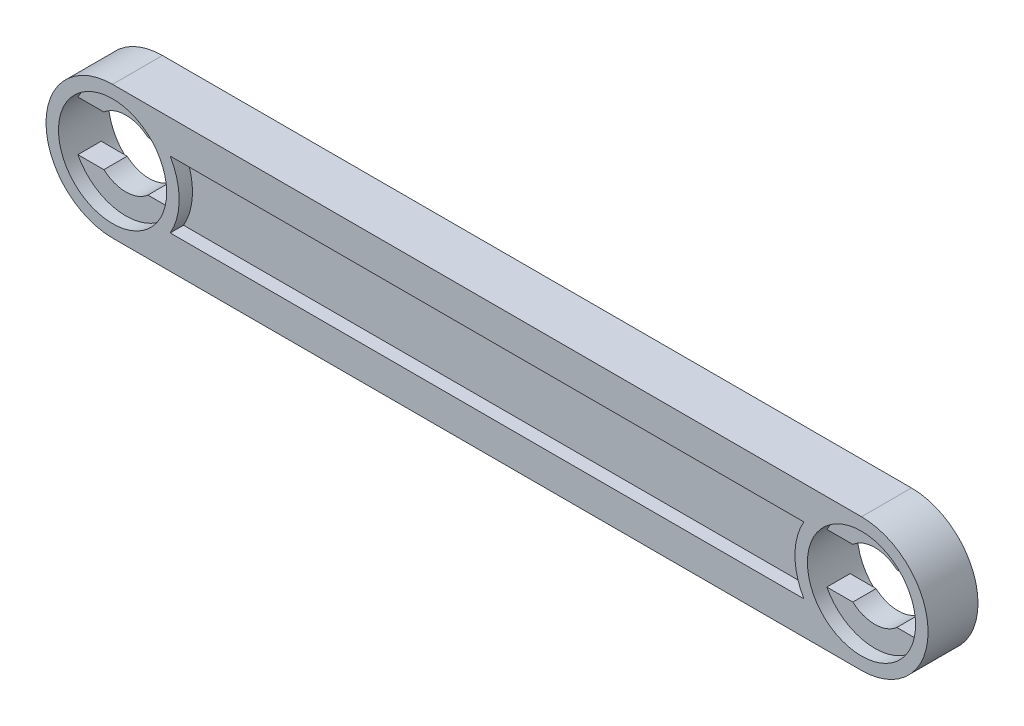
ISO-10303-21;
HEADER;
FILE_DESCRIPTION(('STEP AP214'),'2;1');
FILE_NAME('part.step','',(''),(''),'','','');
FILE_SCHEMA(('AUTOMOTIVE_DESIGN { 1 0 10303 214 1 1 1 1 }'));
ENDSEC;
DATA;
#1=APPLICATION_CONTEXT('core data for automotive mechanical design processes');
#2=APPLICATION_PROTOCOL_DEFINITION('international standard','automotive_design',2000,#1);
#3=PRODUCT_CONTEXT('',#1,'mechanical');
#4=PRODUCT('Part','Part','',(#3));
#5=PRODUCT_RELATED_PRODUCT_CATEGORY('part','',(#4));
#6=PRODUCT_DEFINITION_FORMATION('','',#4);
#7=PRODUCT_DEFINITION_CONTEXT('part definition',#1,'design');
#8=PRODUCT_DEFINITION('design','',#6,#7);
#9=PRODUCT_DEFINITION_SHAPE('','',#8);
#10=(LENGTH_UNIT() NAMED_UNIT(*) SI_UNIT(.MILLI.,.METRE.));
#11=(NAMED_UNIT(*) PLANE_ANGLE_UNIT() SI_UNIT($,.RADIAN.));
#12=(NAMED_UNIT(*) SI_UNIT($,.STERADIAN.) SOLID_ANGLE_UNIT());
#13=UNCERTAINTY_MEASURE_WITH_UNIT(LENGTH_MEASURE(1.E-05),#10,'distance_accuracy_value','');
#14=(GEOMETRIC_REPRESENTATION_CONTEXT(3) GLOBAL_UNCERTAINTY_ASSIGNED_CONTEXT((#13)) GLOBAL_UNIT_ASSIGNED_CONTEXT((#10,
#11,#12)) REPRESENTATION_CONTEXT('',''));
#15=CARTESIAN_POINT('',(0.,0.,0.));
#16=DIRECTION('',(0.,0.,1.));
#17=DIRECTION('',(1.,0.,0.));
#18=AXIS2_PLACEMENT_3D('',#15,#16,#17);
#19=CARTESIAN_POINT('',(0.,0.,0.));
#20=DIRECTION('',(0.,0.,1.));
#21=DIRECTION('',(1.,0.,0.));
#22=AXIS2_PLACEMENT_3D('',#19,#20,#21);
#23=PLANE('',#22);
#24=CARTESIAN_POINT('',(45.,0.,0.));
#25=DIRECTION('',(0.,0.,-1.));
#26=DIRECTION('',(1.,0.,0.));
#27=AXIS2_PLACEMENT_3D('',#24,#25,#26);
#28=CIRCLE('',#27,4.);
#29=CARTESIAN_POINT('',(41.5358983848623,-2.,0.));
#30=VERTEX_POINT('',#29);
#31=CARTESIAN_POINT('',(41.5358983848623,2.,0.));
#32=VERTEX_POINT('',#31);
#33=EDGE_CURVE('E57',#30,#32,#28,.T.);
#34=ORIENTED_EDGE('',*,*,#33,.F.);
#35=DIRECTION('',(1.,0.,0.));
#36=VECTOR('',#35,1.);
#37=CARTESIAN_POINT('',(3.46410161513775,-2.,0.));
#38=LINE('',#37,#36);
#39=CARTESIAN_POINT('',(3.46410161513775,-2.,0.));
#40=VERTEX_POINT('',#39);
#41=EDGE_CURVE('E261',#40,#30,#38,.T.);
#42=ORIENTED_EDGE('',*,*,#41,.F.);
#43=CARTESIAN_POINT('',(0.,0.,0.));
#44=DIRECTION('',(0.,0.,-1.));
#45=DIRECTION('',(1.,0.,0.));
#46=AXIS2_PLACEMENT_3D('',#43,#44,#45);
#47=CIRCLE('',#46,4.);
#48=CARTESIAN_POINT('',(3.46410161513775,2.,0.));
#49=VERTEX_POINT('',#48);
#50=EDGE_CURVE('E275',#49,#40,#47,.T.);
#51=ORIENTED_EDGE('',*,*,#50,.F.);
#52=DIRECTION('',(-1.,0.,0.));
#53=VECTOR('',#52,1.);
#54=CARTESIAN_POINT('',(3.46410161513775,2.,0.));
#55=LINE('',#54,#53);
#56=EDGE_CURVE('E272',#32,#49,#55,.T.);
#57=ORIENTED_EDGE('',*,*,#56,.F.);
#58=EDGE_LOOP('',(#34,#42,#51,#57));
#59=FACE_BOUND('',#58,.T.);
#60=CARTESIAN_POINT('',(0.,0.,0.));
#61=DIRECTION('',(0.,0.,1.));
#62=DIRECTION('',(1.,0.,0.));
#63=AXIS2_PLACEMENT_3D('',#60,#61,#62);
#64=CIRCLE('',#63,4.);
#65=CARTESIAN_POINT('',(0.,4.,0.));
#66=VERTEX_POINT('',#65);
#67=CARTESIAN_POINT('',(0.,-4.,0.));
#68=VERTEX_POINT('',#67);
#69=EDGE_CURVE('E393',#66,#68,#64,.T.);
#70=ORIENTED_EDGE('',*,*,#69,.T.);
#71=DIRECTION('',(1.,0.,0.));
#72=VECTOR('',#71,1.);
#73=CARTESIAN_POINT('',(0.,-4.,0.));
#74=LINE('',#73,#72);
#75=CARTESIAN_POINT('',(45.,-4.,0.));
#76=VERTEX_POINT('',#75);
#77=EDGE_CURVE('E423',#68,#76,#74,.T.);
#78=ORIENTED_EDGE('',*,*,#77,.T.);
#79=CARTESIAN_POINT('',(45.,0.,0.));
#80=DIRECTION('',(0.,0.,1.));
#81=DIRECTION('',(1.,0.,0.));
#82=AXIS2_PLACEMENT_3D('',#79,#80,#81);
#83=CIRCLE('',#82,4.);
#84=CARTESIAN_POINT('',(45.,4.,0.));
#85=VERTEX_POINT('',#84);
#86=EDGE_CURVE('E426',#76,#85,#83,.T.);
#87=ORIENTED_EDGE('',*,*,#86,.T.);
#88=DIRECTION('',(-1.,0.,0.));
#89=VECTOR('',#88,1.);
#90=CARTESIAN_POINT('',(0.,4.,0.));
#91=LINE('',#90,#89);
#92=EDGE_CURVE('E411',#85,#66,#91,.T.);
#93=ORIENTED_EDGE('',*,*,#92,.T.);
#94=EDGE_LOOP('',(#70,#78,#87,#93));
#95=FACE_BOUND('',#94,.T.);
#96=CARTESIAN_POINT('',(0.,0.,0.));
#97=DIRECTION('',(0.,0.,1.));
#98=DIRECTION('',(1.,0.,0.));
#99=AXIS2_PLACEMENT_3D('',#96,#97,#98);
#100=CIRCLE('',#99,3.25);
#101=CARTESIAN_POINT('',(3.25,0.,0.));
#102=VERTEX_POINT('',#101);
#103=EDGE_CURVE('E387',#102,#102,#100,.T.);
#104=ORIENTED_EDGE('',*,*,#103,.F.);
#105=EDGE_LOOP('',(#104));
#106=FACE_BOUND('',#105,.T.);
#107=CARTESIAN_POINT('',(45.,0.,0.));
#108=DIRECTION('',(0.,0.,-1.));
#109=DIRECTION('',(-1.,0.,0.));
#110=AXIS2_PLACEMENT_3D('',#107,#108,#109);
#111=CIRCLE('',#110,3.25);
#112=CARTESIAN_POINT('',(41.75,0.,0.));
#113=VERTEX_POINT('',#112);
#114=EDGE_CURVE('E324',#113,#113,#111,.T.);
#115=ORIENTED_EDGE('',*,*,#114,.T.);
#116=EDGE_LOOP('',(#115));
#117=FACE_BOUND('',#116,.T.);
#118=ADVANCED_FACE('F34',(#59,#95,#106,#117),#23,.T.);
#119=CARTESIAN_POINT('',(47.8831406486677,-1.5,-3.001));
#120=DIRECTION('',(0.,1.,0.));
#121=DIRECTION('',(0.,0.,1.));
#122=AXIS2_PLACEMENT_3D('',#119,#120,#121);
#123=PLANE('',#122);
#124=DIRECTION('',(1.,0.,0.));
#125=VECTOR('',#124,1.);
#126=CARTESIAN_POINT('',(47.8831406486677,-1.5,-2.2));
#127=LINE('',#126,#125);
#128=CARTESIAN_POINT('',(46.3228756555323,-1.5,-2.2));
#129=VERTEX_POINT('',#128);
#130=CARTESIAN_POINT('',(47.8831406486677,-1.5,-2.2));
#131=VERTEX_POINT('',#130);
#132=EDGE_CURVE('E300',#129,#131,#127,.T.);
#133=ORIENTED_EDGE('',*,*,#132,.F.);
#134=DIRECTION('',(0.,0.,1.));
#135=VECTOR('',#134,1.);
#136=CARTESIAN_POINT('',(46.3228756555323,-1.5,-3.001));
#137=LINE('',#136,#135);
#138=CARTESIAN_POINT('',(46.3228756555323,-1.5,-0.8));
#139=VERTEX_POINT('',#138);
#140=EDGE_CURVE('E331',#129,#139,#137,.T.);
#141=ORIENTED_EDGE('',*,*,#140,.T.);
#142=DIRECTION('',(1.,0.,0.));
#143=VECTOR('',#142,1.);
#144=CARTESIAN_POINT('',(47.8831406486677,-1.5,-0.8));
#145=LINE('',#144,#143);
#146=CARTESIAN_POINT('',(47.8831406486677,-1.5,-0.8));
#147=VERTEX_POINT('',#146);
#148=EDGE_CURVE('E318',#139,#147,#145,.T.);
#149=ORIENTED_EDGE('',*,*,#148,.T.);
#150=DIRECTION('',(0.,0.,1.));
#151=VECTOR('',#150,1.);
#152=CARTESIAN_POINT('',(47.8831406486677,-1.5,-3.001));
#153=LINE('',#152,#151);
#154=EDGE_CURVE('E328',#131,#147,#153,.T.);
#155=ORIENTED_EDGE('',*,*,#154,.F.);
#156=EDGE_LOOP('',(#133,#141,#149,#155));
#157=FACE_BOUND('',#156,.T.);
#158=ADVANCED_FACE('F476',(#157),#123,.T.);
#159=CARTESIAN_POINT('',(45.,0.,-3.001));
#160=DIRECTION('',(0.,0.,1.));
#161=DIRECTION('',(1.,0.,0.));
#162=AXIS2_PLACEMENT_3D('',#159,#160,#161);
#163=CYLINDRICAL_SURFACE('',#162,2.);
#164=CARTESIAN_POINT('',(45.,0.,-2.2));
#165=DIRECTION('',(0.,0.,1.));
#166=DIRECTION('',(1.,0.,0.));
#167=AXIS2_PLACEMENT_3D('',#164,#165,#166);
#168=CIRCLE('',#167,2.);
#169=CARTESIAN_POINT('',(43.6771243444677,-1.5,-2.2));
#170=VERTEX_POINT('',#169);
#171=EDGE_CURVE('E298',#170,#129,#168,.T.);
#172=ORIENTED_EDGE('',*,*,#171,.F.);
#173=DIRECTION('',(0.,0.,1.));
#174=VECTOR('',#173,1.);
#175=CARTESIAN_POINT('',(43.6771243444677,-1.5,-3.001));
#176=LINE('',#175,#174);
#177=CARTESIAN_POINT('',(43.6771243444677,-1.5,-0.800000000000001));
#178=VERTEX_POINT('',#177);
#179=EDGE_CURVE('E333',#170,#178,#176,.T.);
#180=ORIENTED_EDGE('',*,*,#179,.T.);
#181=CARTESIAN_POINT('',(45.,0.,-0.8));
#182=DIRECTION('',(0.,0.,1.));
#183=DIRECTION('',(1.,0.,0.));
#184=AXIS2_PLACEMENT_3D('',#181,#182,#183);
#185=CIRCLE('',#184,2.);
#186=EDGE_CURVE('E315',#178,#139,#185,.T.);
#187=ORIENTED_EDGE('',*,*,#186,.T.);
#188=ORIENTED_EDGE('',*,*,#140,.F.);
#189=EDGE_LOOP('',(#172,#180,#187,#188));
#190=FACE_BOUND('',#189,.T.);
#191=ADVANCED_FACE('F482',(#190),#163,.F.);
#192=CARTESIAN_POINT('',(43.6771243444677,-1.5,-3.001));
#193=DIRECTION('',(0.,1.,0.));
#194=DIRECTION('',(0.,0.,1.));
#195=AXIS2_PLACEMENT_3D('',#192,#193,#194);
#196=PLANE('',#195);
#197=DIRECTION('',(1.,0.,0.));
#198=VECTOR('',#197,1.);
#199=CARTESIAN_POINT('',(43.6771243444677,-1.5,-2.2));
#200=LINE('',#199,#198);
#201=CARTESIAN_POINT('',(42.1168593513323,-1.5,-2.2));
#202=VERTEX_POINT('',#201);
#203=EDGE_CURVE('E296',#202,#170,#200,.T.);
#204=ORIENTED_EDGE('',*,*,#203,.F.);
#205=DIRECTION('',(0.,0.,1.));
#206=VECTOR('',#205,1.);
#207=CARTESIAN_POINT('',(42.1168593513323,-1.5,-3.001));
#208=LINE('',#207,#206);
#209=CARTESIAN_POINT('',(42.1168593513323,-1.5,-0.8));
#210=VERTEX_POINT('',#209);
#211=EDGE_CURVE('E335',#202,#210,#208,.T.);
#212=ORIENTED_EDGE('',*,*,#211,.T.);
#213=DIRECTION('',(1.,0.,0.));
#214=VECTOR('',#213,1.);
#215=CARTESIAN_POINT('',(43.6771243444677,-1.5,-0.8));
#216=LINE('',#215,#214);
#217=EDGE_CURVE('E312',#210,#178,#216,.T.);
#218=ORIENTED_EDGE('',*,*,#217,.T.);
#219=ORIENTED_EDGE('',*,*,#179,.F.);
#220=EDGE_LOOP('',(#204,#212,#218,#219));
#221=FACE_BOUND('',#220,.T.);
#222=ADVANCED_FACE('F586',(#221),#196,.T.);
#223=CARTESIAN_POINT('',(43.6771243444677,1.5,-3.001));
#224=DIRECTION('',(0.,-1.,0.));
#225=DIRECTION('',(0.,0.,-1.));
#226=AXIS2_PLACEMENT_3D('',#223,#224,#225);
#227=PLANE('',#226);
#228=DIRECTION('',(-1.,0.,0.));
#229=VECTOR('',#228,1.);
#230=CARTESIAN_POINT('',(43.6771243444677,1.5,-2.2));
#231=LINE('',#230,#229);
#232=CARTESIAN_POINT('',(43.6771243444677,1.5,-2.2));
#233=VERTEX_POINT('',#232);
#234=CARTESIAN_POINT('',(42.1168593513323,1.5,-2.2));
#235=VERTEX_POINT('',#234);
#236=EDGE_CURVE('E294',#233,#235,#231,.T.);
#237=ORIENTED_EDGE('',*,*,#236,.F.);
#238=DIRECTION('',(0.,0.,1.));
#239=VECTOR('',#238,1.);
#240=CARTESIAN_POINT('',(43.6771243444677,1.5,-3.001));
#241=LINE('',#240,#239);
#242=CARTESIAN_POINT('',(43.6771243444677,1.5,-0.8));
#243=VERTEX_POINT('',#242);
#244=EDGE_CURVE('E339',#233,#243,#241,.T.);
#245=ORIENTED_EDGE('',*,*,#244,.T.);
#246=DIRECTION('',(-1.,0.,0.));
#247=VECTOR('',#246,1.);
#248=CARTESIAN_POINT('',(43.6771243444677,1.5,-0.8));
#249=LINE('',#248,#247);
#250=CARTESIAN_POINT('',(42.1168593513323,1.5,-0.8));
#251=VERTEX_POINT('',#250);
#252=EDGE_CURVE('E309',#243,#251,#249,.T.);
#253=ORIENTED_EDGE('',*,*,#252,.T.);
#254=DIRECTION('',(0.,0.,1.));
#255=VECTOR('',#254,1.);
#256=CARTESIAN_POINT('',(42.1168593513323,1.5,-3.001));
#257=LINE('',#256,#255);
#258=EDGE_CURVE('E337',#235,#251,#257,.T.);
#259=ORIENTED_EDGE('',*,*,#258,.F.);
#260=EDGE_LOOP('',(#237,#245,#253,#259));
#261=FACE_BOUND('',#260,.T.);
#262=ADVANCED_FACE('F590',(#261),#227,.T.);
#263=CARTESIAN_POINT('',(45.,0.,-3.001));
#264=DIRECTION('',(0.,0.,1.));
#265=DIRECTION('',(1.,0.,0.));
#266=AXIS2_PLACEMENT_3D('',#263,#264,#265);
#267=CYLINDRICAL_SURFACE('',#266,2.);
#268=CARTESIAN_POINT('',(45.,0.,-2.2));
#269=DIRECTION('',(0.,0.,1.));
#270=DIRECTION('',(1.,0.,0.));
#271=AXIS2_PLACEMENT_3D('',#268,#269,#270);
#272=CIRCLE('',#271,2.);
#273=CARTESIAN_POINT('',(46.3228756555323,1.5,-2.2));
#274=VERTEX_POINT('',#273);
#275=EDGE_CURVE('E292',#274,#233,#272,.T.);
#276=ORIENTED_EDGE('',*,*,#275,.F.);
#277=DIRECTION('',(0.,0.,1.));
#278=VECTOR('',#277,1.);
#279=CARTESIAN_POINT('',(46.3228756555323,1.5,-3.001));
#280=LINE('',#279,#278);
#281=CARTESIAN_POINT('',(46.3228756555323,1.5,-0.800000000000001));
#282=VERTEX_POINT('',#281);
#283=EDGE_CURVE('E341',#274,#282,#280,.T.);
#284=ORIENTED_EDGE('',*,*,#283,.T.);
#285=CARTESIAN_POINT('',(45.,0.,-0.8));
#286=DIRECTION('',(0.,0.,1.));
#287=DIRECTION('',(1.,0.,0.));
#288=AXIS2_PLACEMENT_3D('',#285,#286,#287);
#289=CIRCLE('',#288,2.);
#290=EDGE_CURVE('E306',#282,#243,#289,.T.);
#291=ORIENTED_EDGE('',*,*,#290,.T.);
#292=ORIENTED_EDGE('',*,*,#244,.F.);
#293=EDGE_LOOP('',(#276,#284,#291,#292));
#294=FACE_BOUND('',#293,.T.);
#295=ADVANCED_FACE('F532',(#294),#267,.F.);
#296=CARTESIAN_POINT('',(47.8831406486677,1.5,-3.001));
#297=DIRECTION('',(0.,-1.,0.));
#298=DIRECTION('',(0.,0.,-1.));
#299=AXIS2_PLACEMENT_3D('',#296,#297,#298);
#300=PLANE('',#299);
#301=DIRECTION('',(-1.,0.,0.));
#302=VECTOR('',#301,1.);
#303=CARTESIAN_POINT('',(47.8831406486677,1.5,-2.2));
#304=LINE('',#303,#302);
#305=CARTESIAN_POINT('',(47.8831406486677,1.5,-2.2));
#306=VERTEX_POINT('',#305);
#307=EDGE_CURVE('E290',#306,#274,#304,.T.);
#308=ORIENTED_EDGE('',*,*,#307,.F.);
#309=DIRECTION('',(0.,0.,1.));
#310=VECTOR('',#309,1.);
#311=CARTESIAN_POINT('',(47.8831406486677,1.5,-3.001));
#312=LINE('',#311,#310);
#313=CARTESIAN_POINT('',(47.8831406486677,1.5,-0.8));
#314=VERTEX_POINT('',#313);
#315=EDGE_CURVE('E327',#306,#314,#312,.T.);
#316=ORIENTED_EDGE('',*,*,#315,.T.);
#317=DIRECTION('',(-1.,0.,0.));
#318=VECTOR('',#317,1.);
#319=CARTESIAN_POINT('',(47.8831406486677,1.5,-0.8));
#320=LINE('',#319,#318);
#321=EDGE_CURVE('E11',#314,#282,#320,.T.);
#322=ORIENTED_EDGE('',*,*,#321,.T.);
#323=ORIENTED_EDGE('',*,*,#283,.F.);
#324=EDGE_LOOP('',(#308,#316,#322,#323));
#325=FACE_BOUND('',#324,.T.);
#326=ADVANCED_FACE('F518',(#325),#300,.T.);
#327=CARTESIAN_POINT('',(0.,0.,-3.));
#328=DIRECTION('',(0.,0.,1.));
#329=DIRECTION('',(1.,0.,0.));
#330=AXIS2_PLACEMENT_3D('',#327,#328,#329);
#331=PLANE('',#330);
#332=DIRECTION('',(-1.,0.,0.));
#333=VECTOR('',#332,1.);
#334=CARTESIAN_POINT('',(41.,-2.,-3.));
#335=LINE('',#334,#333);
#336=CARTESIAN_POINT('',(41.,-2.,-3.));
#337=VERTEX_POINT('',#336);
#338=CARTESIAN_POINT('',(4.,-2.,-3.));
#339=VERTEX_POINT('',#338);
#340=EDGE_CURVE('E248',#337,#339,#335,.T.);
#341=ORIENTED_EDGE('',*,*,#340,.F.);
#342=DIRECTION('',(0.,-1.,0.));
#343=VECTOR('',#342,1.);
#344=CARTESIAN_POINT('',(41.,-2.,-3.));
#345=LINE('',#344,#343);
#346=CARTESIAN_POINT('',(41.,2.,-3.));
#347=VERTEX_POINT('',#346);
#348=EDGE_CURVE('E49',#347,#337,#345,.T.);
#349=ORIENTED_EDGE('',*,*,#348,.F.);
#350=DIRECTION('',(1.,0.,0.));
#351=VECTOR('',#350,1.);
#352=CARTESIAN_POINT('',(41.,2.,-3.));
#353=LINE('',#352,#351);
#354=CARTESIAN_POINT('',(4.,2.,-3.));
#355=VERTEX_POINT('',#354);
#356=EDGE_CURVE('E239',#355,#347,#353,.T.);
#357=ORIENTED_EDGE('',*,*,#356,.F.);
#358=DIRECTION('',(0.,1.,0.));
#359=VECTOR('',#358,1.);
#360=CARTESIAN_POINT('',(4.,-2.,-3.));
#361=LINE('',#360,#359);
#362=EDGE_CURVE('E242',#339,#355,#361,.T.);
#363=ORIENTED_EDGE('',*,*,#362,.F.);
#364=EDGE_LOOP('',(#341,#349,#357,#363));
#365=FACE_BOUND('',#364,.T.);
#366=CARTESIAN_POINT('',(0.,0.,-3.));
#367=DIRECTION('',(0.,0.,1.));
#368=DIRECTION('',(1.,0.,0.));
#369=AXIS2_PLACEMENT_3D('',#366,#367,#368);
#370=CIRCLE('',#369,3.25);
#371=CARTESIAN_POINT('',(3.25,0.,-3.));
#372=VERTEX_POINT('',#371);
#373=EDGE_CURVE('E384',#372,#372,#370,.F.);
#374=ORIENTED_EDGE('',*,*,#373,.F.);
#375=EDGE_LOOP('',(#374));
#376=FACE_BOUND('',#375,.T.);
#377=CARTESIAN_POINT('',(0.,0.,-3.));
#378=DIRECTION('',(0.,0.,1.));
#379=DIRECTION('',(1.,0.,0.));
#380=AXIS2_PLACEMENT_3D('',#377,#378,#379);
#381=CIRCLE('',#380,4.);
#382=CARTESIAN_POINT('',(0.,4.,-3.));
#383=VERTEX_POINT('',#382);
#384=CARTESIAN_POINT('',(0.,-4.,-3.));
#385=VERTEX_POINT('',#384);
#386=EDGE_CURVE('E407',#383,#385,#381,.T.);
#387=ORIENTED_EDGE('',*,*,#386,.F.);
#388=DIRECTION('',(-1.,0.,0.));
#389=VECTOR('',#388,1.);
#390=CARTESIAN_POINT('',(0.,4.,-3.));
#391=LINE('',#390,#389);
#392=CARTESIAN_POINT('',(45.,4.,-3.));
#393=VERTEX_POINT('',#392);
#394=EDGE_CURVE('E417',#393,#383,#391,.T.);
#395=ORIENTED_EDGE('',*,*,#394,.F.);
#396=CARTESIAN_POINT('',(45.,0.,-3.));
#397=DIRECTION('',(0.,0.,1.));
#398=DIRECTION('',(1.,0.,0.));
#399=AXIS2_PLACEMENT_3D('',#396,#397,#398);
#400=CIRCLE('',#399,4.);
#401=CARTESIAN_POINT('',(45.,-4.,-3.));
#402=VERTEX_POINT('',#401);
#403=EDGE_CURVE('E414',#402,#393,#400,.T.);
#404=ORIENTED_EDGE('',*,*,#403,.F.);
#405=DIRECTION('',(1.,0.,0.));
#406=VECTOR('',#405,1.);
#407=CARTESIAN_POINT('',(0.,-4.,-3.));
#408=LINE('',#407,#406);
#409=EDGE_CURVE('E410',#385,#402,#408,.T.);
#410=ORIENTED_EDGE('',*,*,#409,.F.);
#411=EDGE_LOOP('',(#387,#395,#404,#410));
#412=FACE_BOUND('',#411,.T.);
#413=CARTESIAN_POINT('',(45.,0.,-3.));
#414=DIRECTION('',(0.,0.,1.));
#415=DIRECTION('',(1.,0.,0.));
#416=AXIS2_PLACEMENT_3D('',#413,#414,#415);
#417=CIRCLE('',#416,3.25);
#418=CARTESIAN_POINT('',(48.25,0.,-3.));
#419=VERTEX_POINT('',#418);
#420=EDGE_CURVE('E321',#419,#419,#417,.T.);
#421=ORIENTED_EDGE('',*,*,#420,.T.);
#422=EDGE_LOOP('',(#421));
#423=FACE_BOUND('',#422,.T.);
#424=ADVANCED_FACE('F488',(#365,#376,#412,#423),#331,.F.);
#425=CARTESIAN_POINT('',(-2.8831406486677,1.5,-3.001));
#426=DIRECTION('',(0.,1.,0.));
#427=DIRECTION('',(0.,0.,1.));
#428=AXIS2_PLACEMENT_3D('',#425,#426,#427);
#429=PLANE('',#428);
#430=DIRECTION('',(0.,0.,1.));
#431=VECTOR('',#430,1.);
#432=CARTESIAN_POINT('',(-2.8831406486677,1.5,-3.001));
#433=LINE('',#432,#431);
#434=CARTESIAN_POINT('',(-2.8831406486677,1.5,-2.2));
#435=VERTEX_POINT('',#434);
#436=CARTESIAN_POINT('',(-2.8831406486677,1.5,-0.8));
#437=VERTEX_POINT('',#436);
#438=EDGE_CURVE('E391',#435,#437,#433,.T.);
#439=ORIENTED_EDGE('',*,*,#438,.F.);
#440=DIRECTION('',(1.,0.,0.));
#441=VECTOR('',#440,1.);
#442=CARTESIAN_POINT('',(-2.8831406486677,1.5,-2.2));
#443=LINE('',#442,#441);
#444=CARTESIAN_POINT('',(-1.3228756555323,1.5,-2.2));
#445=VERTEX_POINT('',#444);
#446=EDGE_CURVE('E362',#435,#445,#443,.T.);
#447=ORIENTED_EDGE('',*,*,#446,.T.);
#448=DIRECTION('',(0.,0.,1.));
#449=VECTOR('',#448,1.);
#450=CARTESIAN_POINT('',(-1.3228756555323,1.5,-3.001));
#451=LINE('',#450,#449);
#452=CARTESIAN_POINT('',(-1.3228756555323,1.5,-0.8));
#453=VERTEX_POINT('',#452);
#454=EDGE_CURVE('E394',#445,#453,#451,.T.);
#455=ORIENTED_EDGE('',*,*,#454,.T.);
#456=DIRECTION('',(1.,0.,0.));
#457=VECTOR('',#456,1.);
#458=CARTESIAN_POINT('',(-2.8831406486677,1.5,-0.8));
#459=LINE('',#458,#457);
#460=EDGE_CURVE('E381',#437,#453,#459,.T.);
#461=ORIENTED_EDGE('',*,*,#460,.F.);
#462=EDGE_LOOP('',(#439,#447,#455,#461));
#463=FACE_BOUND('',#462,.T.);
#464=ADVANCED_FACE('F517',(#463),#429,.F.);
#465=CARTESIAN_POINT('',(0.,0.,-3.001));
#466=DIRECTION('',(0.,0.,1.));
#467=DIRECTION('',(1.,0.,0.));
#468=AXIS2_PLACEMENT_3D('',#465,#466,#467);
#469=CYLINDRICAL_SURFACE('',#468,2.);
#470=ORIENTED_EDGE('',*,*,#454,.F.);
#471=CARTESIAN_POINT('',(0.,0.,-2.2));
#472=DIRECTION('',(0.,0.,1.));
#473=DIRECTION('',(1.,0.,0.));
#474=AXIS2_PLACEMENT_3D('',#471,#472,#473);
#475=CIRCLE('',#474,2.);
#476=CARTESIAN_POINT('',(1.3228756555323,1.5,-2.2));
#477=VERTEX_POINT('',#476);
#478=EDGE_CURVE('E359',#445,#477,#475,.F.);
#479=ORIENTED_EDGE('',*,*,#478,.T.);
#480=DIRECTION('',(0.,0.,1.));
#481=VECTOR('',#480,1.);
#482=CARTESIAN_POINT('',(1.3228756555323,1.5,-3.001));
#483=LINE('',#482,#481);
#484=CARTESIAN_POINT('',(1.3228756555323,1.5,-0.800000000000001));
#485=VERTEX_POINT('',#484);
#486=EDGE_CURVE('E396',#477,#485,#483,.T.);
#487=ORIENTED_EDGE('',*,*,#486,.T.);
#488=CARTESIAN_POINT('',(0.,0.,-0.8));
#489=DIRECTION('',(0.,0.,1.));
#490=DIRECTION('',(1.,0.,0.));
#491=AXIS2_PLACEMENT_3D('',#488,#489,#490);
#492=CIRCLE('',#491,2.);
#493=EDGE_CURVE('E378',#453,#485,#492,.F.);
#494=ORIENTED_EDGE('',*,*,#493,.F.);
#495=EDGE_LOOP('',(#470,#479,#487,#494));
#496=FACE_BOUND('',#495,.T.);
#497=ADVANCED_FACE('F529',(#496),#469,.F.);
#498=CARTESIAN_POINT('',(1.3228756555323,1.5,-3.001));
#499=DIRECTION('',(0.,1.,0.));
#500=DIRECTION('',(0.,0.,1.));
#501=AXIS2_PLACEMENT_3D('',#498,#499,#500);
#502=PLANE('',#501);
#503=ORIENTED_EDGE('',*,*,#486,.F.);
#504=DIRECTION('',(1.,0.,0.));
#505=VECTOR('',#504,1.);
#506=CARTESIAN_POINT('',(1.3228756555323,1.5,-2.2));
#507=LINE('',#506,#505);
#508=CARTESIAN_POINT('',(2.8831406486677,1.5,-2.2));
#509=VERTEX_POINT('',#508);
#510=EDGE_CURVE('E356',#477,#509,#507,.T.);
#511=ORIENTED_EDGE('',*,*,#510,.T.);
#512=DIRECTION('',(0.,0.,1.));
#513=VECTOR('',#512,1.);
#514=CARTESIAN_POINT('',(2.8831406486677,1.5,-3.001));
#515=LINE('',#514,#513);
#516=CARTESIAN_POINT('',(2.8831406486677,1.5,-0.8));
#517=VERTEX_POINT('',#516);
#518=EDGE_CURVE('E398',#509,#517,#515,.T.);
#519=ORIENTED_EDGE('',*,*,#518,.T.);
#520=DIRECTION('',(1.,0.,0.));
#521=VECTOR('',#520,1.);
#522=CARTESIAN_POINT('',(1.3228756555323,1.5,-0.8));
#523=LINE('',#522,#521);
#524=EDGE_CURVE('E375',#485,#517,#523,.T.);
#525=ORIENTED_EDGE('',*,*,#524,.F.);
#526=EDGE_LOOP('',(#503,#511,#519,#525));
#527=FACE_BOUND('',#526,.T.);
#528=ADVANCED_FACE('F807',(#527),#502,.F.);
#529=CARTESIAN_POINT('',(1.3228756555323,-1.5,-3.001));
#530=DIRECTION('',(0.,-1.,0.));
#531=DIRECTION('',(0.,0.,-1.));
#532=AXIS2_PLACEMENT_3D('',#529,#530,#531);
#533=PLANE('',#532);
#534=DIRECTION('',(0.,0.,1.));
#535=VECTOR('',#534,1.);
#536=CARTESIAN_POINT('',(2.8831406486677,-1.5,-3.001));
#537=LINE('',#536,#535);
#538=CARTESIAN_POINT('',(2.8831406486677,-1.5,-2.2));
#539=VERTEX_POINT('',#538);
#540=CARTESIAN_POINT('',(2.8831406486677,-1.5,-0.8));
#541=VERTEX_POINT('',#540);
#542=EDGE_CURVE('E400',#539,#541,#537,.T.);
#543=ORIENTED_EDGE('',*,*,#542,.F.);
#544=DIRECTION('',(-1.,0.,0.));
#545=VECTOR('',#544,1.);
#546=CARTESIAN_POINT('',(1.3228756555323,-1.5,-2.2));
#547=LINE('',#546,#545);
#548=CARTESIAN_POINT('',(1.32287565553229,-1.5,-2.2));
#549=VERTEX_POINT('',#548);
#550=EDGE_CURVE('E353',#539,#549,#547,.T.);
#551=ORIENTED_EDGE('',*,*,#550,.T.);
#552=DIRECTION('',(0.,0.,1.));
#553=VECTOR('',#552,1.);
#554=CARTESIAN_POINT('',(1.32287565553229,-1.5,-3.001));
#555=LINE('',#554,#553);
#556=CARTESIAN_POINT('',(1.32287565553229,-1.5,-0.8));
#557=VERTEX_POINT('',#556);
#558=EDGE_CURVE('E402',#549,#557,#555,.T.);
#559=ORIENTED_EDGE('',*,*,#558,.T.);
#560=DIRECTION('',(-1.,0.,0.));
#561=VECTOR('',#560,1.);
#562=CARTESIAN_POINT('',(1.3228756555323,-1.5,-0.8));
#563=LINE('',#562,#561);
#564=EDGE_CURVE('E372',#541,#557,#563,.T.);
#565=ORIENTED_EDGE('',*,*,#564,.F.);
#566=EDGE_LOOP('',(#543,#551,#559,#565));
#567=FACE_BOUND('',#566,.T.);
#568=ADVANCED_FACE('F454',(#567),#533,.F.);
#569=CARTESIAN_POINT('',(0.,0.,-3.001));
#570=DIRECTION('',(0.,0.,1.));
#571=DIRECTION('',(1.,0.,0.));
#572=AXIS2_PLACEMENT_3D('',#569,#570,#571);
#573=CYLINDRICAL_SURFACE('',#572,2.);
#574=ORIENTED_EDGE('',*,*,#558,.F.);
#575=CARTESIAN_POINT('',(0.,0.,-2.2));
#576=DIRECTION('',(0.,0.,1.));
#577=DIRECTION('',(1.,0.,0.));
#578=AXIS2_PLACEMENT_3D('',#575,#576,#577);
#579=CIRCLE('',#578,2.);
#580=CARTESIAN_POINT('',(-1.3228756555323,-1.5,-2.2));
#581=VERTEX_POINT('',#580);
#582=EDGE_CURVE('E350',#549,#581,#579,.F.);
#583=ORIENTED_EDGE('',*,*,#582,.T.);
#584=DIRECTION('',(0.,0.,1.));
#585=VECTOR('',#584,1.);
#586=CARTESIAN_POINT('',(-1.3228756555323,-1.5,-3.001));
#587=LINE('',#586,#585);
#588=CARTESIAN_POINT('',(-1.3228756555323,-1.5,-0.800000000000001));
#589=VERTEX_POINT('',#588);
#590=EDGE_CURVE('E404',#581,#589,#587,.T.);
#591=ORIENTED_EDGE('',*,*,#590,.T.);
#592=CARTESIAN_POINT('',(0.,0.,-0.8));
#593=DIRECTION('',(0.,0.,1.));
#594=DIRECTION('',(1.,0.,0.));
#595=AXIS2_PLACEMENT_3D('',#592,#593,#594);
#596=CIRCLE('',#595,2.);
#597=EDGE_CURVE('E369',#557,#589,#596,.F.);
#598=ORIENTED_EDGE('',*,*,#597,.F.);
#599=EDGE_LOOP('',(#574,#583,#591,#598));
#600=FACE_BOUND('',#599,.T.);
#601=ADVANCED_FACE('F457',(#600),#573,.F.);
#602=CARTESIAN_POINT('',(-2.8831406486677,-1.5,-3.001));
#603=DIRECTION('',(0.,-1.,0.));
#604=DIRECTION('',(0.,0.,-1.));
#605=AXIS2_PLACEMENT_3D('',#602,#603,#604);
#606=PLANE('',#605);
#607=ORIENTED_EDGE('',*,*,#590,.F.);
#608=DIRECTION('',(-1.,0.,0.));
#609=VECTOR('',#608,1.);
#610=CARTESIAN_POINT('',(-2.8831406486677,-1.5,-2.2));
#611=LINE('',#610,#609);
#612=CARTESIAN_POINT('',(-2.8831406486677,-1.5,-2.2));
#613=VERTEX_POINT('',#612);
#614=EDGE_CURVE('E347',#581,#613,#611,.T.);
#615=ORIENTED_EDGE('',*,*,#614,.T.);
#616=DIRECTION('',(0.,0.,1.));
#617=VECTOR('',#616,1.);
#618=CARTESIAN_POINT('',(-2.8831406486677,-1.5,-3.001));
#619=LINE('',#618,#617);
#620=CARTESIAN_POINT('',(-2.8831406486677,-1.5,-0.8));
#621=VERTEX_POINT('',#620);
#622=EDGE_CURVE('E390',#613,#621,#619,.T.);
#623=ORIENTED_EDGE('',*,*,#622,.T.);
#624=DIRECTION('',(-1.,0.,0.));
#625=VECTOR('',#624,1.);
#626=CARTESIAN_POINT('',(-2.8831406486677,-1.5,-0.8));
#627=LINE('',#626,#625);
#628=EDGE_CURVE('E42',#589,#621,#627,.T.);
#629=ORIENTED_EDGE('',*,*,#628,.F.);
#630=EDGE_LOOP('',(#607,#615,#623,#629));
#631=FACE_BOUND('',#630,.T.);
#632=ADVANCED_FACE('F458',(#631),#606,.F.);
#633=CARTESIAN_POINT('',(0.,0.,-3.));
#634=DIRECTION('',(0.,0.,1.));
#635=DIRECTION('',(1.,0.,0.));
#636=AXIS2_PLACEMENT_3D('',#633,#634,#635);
#637=CYLINDRICAL_SURFACE('',#636,4.);
#638=ORIENTED_EDGE('',*,*,#69,.F.);
#639=DIRECTION('',(0.,0.,1.));
#640=VECTOR('',#639,1.);
#641=CARTESIAN_POINT('',(0.,4.,-3.));
#642=LINE('',#641,#640);
#643=EDGE_CURVE('E431',#383,#66,#642,.T.);
#644=ORIENTED_EDGE('',*,*,#643,.F.);
#645=ORIENTED_EDGE('',*,*,#386,.T.);
#646=DIRECTION('',(0.,0.,1.));
#647=VECTOR('',#646,1.);
#648=CARTESIAN_POINT('',(0.,-4.,-3.));
#649=LINE('',#648,#647);
#650=EDGE_CURVE('E420',#385,#68,#649,.T.);
#651=ORIENTED_EDGE('',*,*,#650,.T.);
#652=EDGE_LOOP('',(#638,#644,#645,#651));
#653=FACE_BOUND('',#652,.T.);
#654=ADVANCED_FACE('F36',(#653),#637,.T.);
#655=CARTESIAN_POINT('',(0.,4.,-3.));
#656=DIRECTION('',(0.,1.,0.));
#657=DIRECTION('',(0.,0.,1.));
#658=AXIS2_PLACEMENT_3D('',#655,#656,#657);
#659=PLANE('',#658);
#660=ORIENTED_EDGE('',*,*,#92,.F.);
#661=DIRECTION('',(0.,0.,1.));
#662=VECTOR('',#661,1.);
#663=CARTESIAN_POINT('',(45.,4.,-3.));
#664=LINE('',#663,#662);
#665=EDGE_CURVE('E433',#393,#85,#664,.T.);
#666=ORIENTED_EDGE('',*,*,#665,.F.);
#667=ORIENTED_EDGE('',*,*,#394,.T.);
#668=ORIENTED_EDGE('',*,*,#643,.T.);
#669=EDGE_LOOP('',(#660,#666,#667,#668));
#670=FACE_BOUND('',#669,.T.);
#671=ADVANCED_FACE('F490',(#670),#659,.T.);
#672=CARTESIAN_POINT('',(45.,0.,-3.));
#673=DIRECTION('',(0.,0.,1.));
#674=DIRECTION('',(1.,0.,0.));
#675=AXIS2_PLACEMENT_3D('',#672,#673,#674);
#676=CYLINDRICAL_SURFACE('',#675,4.);
#677=ORIENTED_EDGE('',*,*,#86,.F.);
#678=DIRECTION('',(0.,0.,1.));
#679=VECTOR('',#678,1.);
#680=CARTESIAN_POINT('',(45.,-4.,-3.));
#681=LINE('',#680,#679);
#682=EDGE_CURVE('E435',#402,#76,#681,.T.);
#683=ORIENTED_EDGE('',*,*,#682,.F.);
#684=ORIENTED_EDGE('',*,*,#403,.T.);
#685=ORIENTED_EDGE('',*,*,#665,.T.);
#686=EDGE_LOOP('',(#677,#683,#684,#685));
#687=FACE_BOUND('',#686,.T.);
#688=ADVANCED_FACE('F493',(#687),#676,.T.);
#689=CARTESIAN_POINT('',(0.,-4.,-3.));
#690=DIRECTION('',(0.,-1.,0.));
#691=DIRECTION('',(0.,0.,-1.));
#692=AXIS2_PLACEMENT_3D('',#689,#690,#691);
#693=PLANE('',#692);
#694=ORIENTED_EDGE('',*,*,#77,.F.);
#695=ORIENTED_EDGE('',*,*,#650,.F.);
#696=ORIENTED_EDGE('',*,*,#409,.T.);
#697=ORIENTED_EDGE('',*,*,#682,.T.);
#698=EDGE_LOOP('',(#694,#695,#696,#697));
#699=FACE_BOUND('',#698,.T.);
#700=ADVANCED_FACE('F496',(#699),#693,.T.);
#701=CARTESIAN_POINT('',(0.,0.,-3.001));
#702=DIRECTION('',(0.,0.,1.));
#703=DIRECTION('',(1.,0.,0.));
#704=AXIS2_PLACEMENT_3D('',#701,#702,#703);
#705=CYLINDRICAL_SURFACE('',#704,3.25);
#706=CARTESIAN_POINT('',(0.,0.,-2.2));
#707=DIRECTION('',(0.,0.,1.));
#708=DIRECTION('',(1.,0.,0.));
#709=AXIS2_PLACEMENT_3D('',#706,#707,#708);
#710=CIRCLE('',#709,3.25);
#711=EDGE_CURVE('E344',#509,#435,#710,.T.);
#712=ORIENTED_EDGE('',*,*,#711,.T.);
#713=ORIENTED_EDGE('',*,*,#438,.T.);
#714=CARTESIAN_POINT('',(0.,0.,-0.8));
#715=DIRECTION('',(0.,0.,1.));
#716=DIRECTION('',(1.,0.,0.));
#717=AXIS2_PLACEMENT_3D('',#714,#715,#716);
#718=CIRCLE('',#717,3.25);
#719=EDGE_CURVE('E366',#517,#437,#718,.T.);
#720=ORIENTED_EDGE('',*,*,#719,.F.);
#721=ORIENTED_EDGE('',*,*,#518,.F.);
#722=EDGE_LOOP('',(#712,#713,#720,#721));
#723=FACE_BOUND('',#722,.T.);
#724=EDGE_CURVE('E330',#613,#539,#710,.T.);
#725=ORIENTED_EDGE('',*,*,#724,.T.);
#726=ORIENTED_EDGE('',*,*,#542,.T.);
#727=EDGE_CURVE('E365',#621,#541,#718,.T.);
#728=ORIENTED_EDGE('',*,*,#727,.F.);
#729=ORIENTED_EDGE('',*,*,#622,.F.);
#730=EDGE_LOOP('',(#725,#726,#728,#729));
#731=FACE_BOUND('',#730,.T.);
#732=ORIENTED_EDGE('',*,*,#103,.T.);
#733=EDGE_LOOP('',(#732));
#734=FACE_BOUND('',#733,.T.);
#735=ORIENTED_EDGE('',*,*,#373,.T.);
#736=EDGE_LOOP('',(#735));
#737=FACE_BOUND('',#736,.T.);
#738=ADVANCED_FACE('F450',(#723,#731,#734,#737),#705,.F.);
#739=CARTESIAN_POINT('',(0.,0.,-0.8));
#740=DIRECTION('',(0.,0.,1.));
#741=DIRECTION('',(1.,0.,0.));
#742=AXIS2_PLACEMENT_3D('',#739,#740,#741);
#743=PLANE('',#742);
#744=ORIENTED_EDGE('',*,*,#564,.T.);
#745=ORIENTED_EDGE('',*,*,#597,.T.);
#746=ORIENTED_EDGE('',*,*,#628,.T.);
#747=ORIENTED_EDGE('',*,*,#727,.T.);
#748=EDGE_LOOP('',(#744,#745,#746,#747));
#749=FACE_BOUND('',#748,.T.);
#750=ADVANCED_FACE('F442',(#749),#743,.T.);
#751=ORIENTED_EDGE('',*,*,#460,.T.);
#752=ORIENTED_EDGE('',*,*,#493,.T.);
#753=ORIENTED_EDGE('',*,*,#524,.T.);
#754=ORIENTED_EDGE('',*,*,#719,.T.);
#755=EDGE_LOOP('',(#751,#752,#753,#754));
#756=FACE_BOUND('',#755,.T.);
#757=ADVANCED_FACE('F472',(#756),#743,.T.);
#758=CARTESIAN_POINT('',(0.,0.,-2.2));
#759=DIRECTION('',(0.,0.,1.));
#760=DIRECTION('',(1.,0.,0.));
#761=AXIS2_PLACEMENT_3D('',#758,#759,#760);
#762=PLANE('',#761);
#763=ORIENTED_EDGE('',*,*,#711,.F.);
#764=ORIENTED_EDGE('',*,*,#510,.F.);
#765=ORIENTED_EDGE('',*,*,#478,.F.);
#766=ORIENTED_EDGE('',*,*,#446,.F.);
#767=EDGE_LOOP('',(#763,#764,#765,#766));
#768=FACE_BOUND('',#767,.T.);
#769=ADVANCED_FACE('F463',(#768),#762,.F.);
#770=ORIENTED_EDGE('',*,*,#724,.F.);
#771=ORIENTED_EDGE('',*,*,#614,.F.);
#772=ORIENTED_EDGE('',*,*,#582,.F.);
#773=ORIENTED_EDGE('',*,*,#550,.F.);
#774=EDGE_LOOP('',(#770,#771,#772,#773));
#775=FACE_BOUND('',#774,.T.);
#776=ADVANCED_FACE('F460',(#775),#762,.F.);
#777=CARTESIAN_POINT('',(45.,0.,-3.001));
#778=DIRECTION('',(0.,0.,1.));
#779=DIRECTION('',(1.,0.,0.));
#780=AXIS2_PLACEMENT_3D('',#777,#778,#779);
#781=CYLINDRICAL_SURFACE('',#780,3.25);
#782=CARTESIAN_POINT('',(45.,0.,-2.2));
#783=DIRECTION('',(0.,0.,-1.));
#784=DIRECTION('',(-1.,0.,0.));
#785=AXIS2_PLACEMENT_3D('',#782,#783,#784);
#786=CIRCLE('',#785,3.25);
#787=EDGE_CURVE('E282',#131,#202,#786,.T.);
#788=ORIENTED_EDGE('',*,*,#787,.F.);
#789=ORIENTED_EDGE('',*,*,#154,.T.);
#790=CARTESIAN_POINT('',(45.,0.,-0.8));
#791=DIRECTION('',(0.,0.,-1.));
#792=DIRECTION('',(-1.,0.,0.));
#793=AXIS2_PLACEMENT_3D('',#790,#791,#792);
#794=CIRCLE('',#793,3.25);
#795=EDGE_CURVE('E302',#147,#210,#794,.T.);
#796=ORIENTED_EDGE('',*,*,#795,.T.);
#797=ORIENTED_EDGE('',*,*,#211,.F.);
#798=EDGE_LOOP('',(#788,#789,#796,#797));
#799=FACE_BOUND('',#798,.T.);
#800=EDGE_CURVE('E288',#235,#306,#786,.T.);
#801=ORIENTED_EDGE('',*,*,#800,.F.);
#802=ORIENTED_EDGE('',*,*,#258,.T.);
#803=EDGE_CURVE('E303',#251,#314,#794,.T.);
#804=ORIENTED_EDGE('',*,*,#803,.T.);
#805=ORIENTED_EDGE('',*,*,#315,.F.);
#806=EDGE_LOOP('',(#801,#802,#804,#805));
#807=FACE_BOUND('',#806,.T.);
#808=ORIENTED_EDGE('',*,*,#420,.F.);
#809=EDGE_LOOP('',(#808));
#810=FACE_BOUND('',#809,.T.);
#811=ORIENTED_EDGE('',*,*,#114,.F.);
#812=EDGE_LOOP('',(#811));
#813=FACE_BOUND('',#812,.T.);
#814=ADVANCED_FACE('F462',(#799,#807,#810,#813),#781,.F.);
#815=CARTESIAN_POINT('',(45.,0.,-0.8));
#816=DIRECTION('',(0.,0.,1.));
#817=DIRECTION('',(-1.,0.,0.));
#818=AXIS2_PLACEMENT_3D('',#815,#816,#817);
#819=PLANE('',#818);
#820=ORIENTED_EDGE('',*,*,#290,.F.);
#821=ORIENTED_EDGE('',*,*,#321,.F.);
#822=ORIENTED_EDGE('',*,*,#803,.F.);
#823=ORIENTED_EDGE('',*,*,#252,.F.);
#824=EDGE_LOOP('',(#820,#821,#822,#823));
#825=FACE_BOUND('',#824,.T.);
#826=ADVANCED_FACE('F469',(#825),#819,.T.);
#827=ORIENTED_EDGE('',*,*,#186,.F.);
#828=ORIENTED_EDGE('',*,*,#217,.F.);
#829=ORIENTED_EDGE('',*,*,#795,.F.);
#830=ORIENTED_EDGE('',*,*,#148,.F.);
#831=EDGE_LOOP('',(#827,#828,#829,#830));
#832=FACE_BOUND('',#831,.T.);
#833=ADVANCED_FACE('F581',(#832),#819,.T.);
#834=CARTESIAN_POINT('',(45.,0.,-2.2));
#835=DIRECTION('',(0.,0.,1.));
#836=DIRECTION('',(-1.,0.,0.));
#837=AXIS2_PLACEMENT_3D('',#834,#835,#836);
#838=PLANE('',#837);
#839=ORIENTED_EDGE('',*,*,#132,.T.);
#840=ORIENTED_EDGE('',*,*,#787,.T.);
#841=ORIENTED_EDGE('',*,*,#203,.T.);
#842=ORIENTED_EDGE('',*,*,#171,.T.);
#843=EDGE_LOOP('',(#839,#840,#841,#842));
#844=FACE_BOUND('',#843,.T.);
#845=ADVANCED_FACE('F578',(#844),#838,.F.);
#846=ORIENTED_EDGE('',*,*,#236,.T.);
#847=ORIENTED_EDGE('',*,*,#800,.T.);
#848=ORIENTED_EDGE('',*,*,#307,.T.);
#849=ORIENTED_EDGE('',*,*,#275,.T.);
#850=EDGE_LOOP('',(#846,#847,#848,#849));
#851=FACE_BOUND('',#850,.T.);
#852=ADVANCED_FACE('F575',(#851),#838,.F.);
#853=CARTESIAN_POINT('',(45.,0.,-0.8));
#854=DIRECTION('',(0.,0.,1.));
#855=DIRECTION('',(1.,0.,0.));
#856=AXIS2_PLACEMENT_3D('',#853,#854,#855);
#857=CYLINDRICAL_SURFACE('',#856,4.);
#858=ORIENTED_EDGE('',*,*,#33,.T.);
#859=DIRECTION('',(0.,0.,1.));
#860=VECTOR('',#859,1.);
#861=CARTESIAN_POINT('',(41.5358983848623,2.,-0.8));
#862=LINE('',#861,#860);
#863=CARTESIAN_POINT('',(41.5358983848623,2.,-0.8));
#864=VERTEX_POINT('',#863);
#865=EDGE_CURVE('E270',#864,#32,#862,.T.);
#866=ORIENTED_EDGE('',*,*,#865,.F.);
#867=CARTESIAN_POINT('',(45.,0.,-0.8));
#868=DIRECTION('',(0.,0.,-1.));
#869=DIRECTION('',(1.,0.,0.));
#870=AXIS2_PLACEMENT_3D('',#867,#868,#869);
#871=CIRCLE('',#870,4.);
#872=CARTESIAN_POINT('',(41.5358983848623,-2.,-0.8));
#873=VERTEX_POINT('',#872);
#874=EDGE_CURVE('E257',#873,#864,#871,.T.);
#875=ORIENTED_EDGE('',*,*,#874,.F.);
#876=DIRECTION('',(0.,0.,1.));
#877=VECTOR('',#876,1.);
#878=CARTESIAN_POINT('',(41.5358983848623,-2.,-0.8));
#879=LINE('',#878,#877);
#880=EDGE_CURVE('E280',#873,#30,#879,.T.);
#881=ORIENTED_EDGE('',*,*,#880,.T.);
#882=EDGE_LOOP('',(#858,#866,#875,#881));
#883=FACE_BOUND('',#882,.T.);
#884=ADVANCED_FACE('F565',(#883),#857,.T.);
#885=CARTESIAN_POINT('',(3.46410161513775,-2.,-0.8));
#886=DIRECTION('',(0.,-1.,0.));
#887=DIRECTION('',(1.,0.,0.));
#888=AXIS2_PLACEMENT_3D('',#885,#886,#887);
#889=PLANE('',#888);
#890=ORIENTED_EDGE('',*,*,#41,.T.);
#891=ORIENTED_EDGE('',*,*,#880,.F.);
#892=DIRECTION('',(1.,0.,0.));
#893=VECTOR('',#892,1.);
#894=CARTESIAN_POINT('',(3.46410161513775,-2.,-0.8));
#895=LINE('',#894,#893);
#896=CARTESIAN_POINT('',(3.46410161513775,-2.,-0.8));
#897=VERTEX_POINT('',#896);
#898=EDGE_CURVE('E267',#897,#873,#895,.T.);
#899=ORIENTED_EDGE('',*,*,#898,.F.);
#900=DIRECTION('',(0.,0.,1.));
#901=VECTOR('',#900,1.);
#902=CARTESIAN_POINT('',(3.46410161513775,-2.,-0.8));
#903=LINE('',#902,#901);
#904=EDGE_CURVE('E283',#897,#40,#903,.T.);
#905=ORIENTED_EDGE('',*,*,#904,.T.);
#906=EDGE_LOOP('',(#890,#891,#899,#905));
#907=FACE_BOUND('',#906,.T.);
#908=ADVANCED_FACE('F561',(#907),#889,.F.);
#909=CARTESIAN_POINT('',(0.,0.,-0.8));
#910=DIRECTION('',(0.,0.,1.));
#911=DIRECTION('',(1.,0.,0.));
#912=AXIS2_PLACEMENT_3D('',#909,#910,#911);
#913=CYLINDRICAL_SURFACE('',#912,4.);
#914=ORIENTED_EDGE('',*,*,#50,.T.);
#915=ORIENTED_EDGE('',*,*,#904,.F.);
#916=CARTESIAN_POINT('',(0.,0.,-0.8));
#917=DIRECTION('',(0.,0.,-1.));
#918=DIRECTION('',(1.,0.,0.));
#919=AXIS2_PLACEMENT_3D('',#916,#917,#918);
#920=CIRCLE('',#919,4.);
#921=CARTESIAN_POINT('',(3.46410161513775,2.,-0.8));
#922=VERTEX_POINT('',#921);
#923=EDGE_CURVE('E264',#922,#897,#920,.T.);
#924=ORIENTED_EDGE('',*,*,#923,.F.);
#925=DIRECTION('',(0.,0.,1.));
#926=VECTOR('',#925,1.);
#927=CARTESIAN_POINT('',(3.46410161513775,2.,-0.8));
#928=LINE('',#927,#926);
#929=EDGE_CURVE('E285',#922,#49,#928,.T.);
#930=ORIENTED_EDGE('',*,*,#929,.T.);
#931=EDGE_LOOP('',(#914,#915,#924,#930));
#932=FACE_BOUND('',#931,.T.);
#933=ADVANCED_FACE('F564',(#932),#913,.T.);
#934=CARTESIAN_POINT('',(3.46410161513775,2.,-0.8));
#935=DIRECTION('',(0.,1.,0.));
#936=DIRECTION('',(-1.,0.,0.));
#937=AXIS2_PLACEMENT_3D('',#934,#935,#936);
#938=PLANE('',#937);
#939=ORIENTED_EDGE('',*,*,#56,.T.);
#940=ORIENTED_EDGE('',*,*,#929,.F.);
#941=DIRECTION('',(-1.,0.,0.));
#942=VECTOR('',#941,1.);
#943=CARTESIAN_POINT('',(3.46410161513775,2.,-0.8));
#944=LINE('',#943,#942);
#945=EDGE_CURVE('E260',#864,#922,#944,.T.);
#946=ORIENTED_EDGE('',*,*,#945,.F.);
#947=ORIENTED_EDGE('',*,*,#865,.T.);
#948=EDGE_LOOP('',(#939,#940,#946,#947));
#949=FACE_BOUND('',#948,.T.);
#950=ADVANCED_FACE('F559',(#949),#938,.F.);
#951=CARTESIAN_POINT('',(45.,0.,-0.8));
#952=DIRECTION('',(0.,0.,1.));
#953=DIRECTION('',(1.,0.,0.));
#954=AXIS2_PLACEMENT_3D('',#951,#952,#953);
#955=PLANE('',#954);
#956=ORIENTED_EDGE('',*,*,#874,.T.);
#957=ORIENTED_EDGE('',*,*,#945,.T.);
#958=ORIENTED_EDGE('',*,*,#923,.T.);
#959=ORIENTED_EDGE('',*,*,#898,.T.);
#960=EDGE_LOOP('',(#956,#957,#958,#959));
#961=FACE_BOUND('',#960,.T.);
#962=ADVANCED_FACE('F551',(#961),#955,.T.);
#963=CARTESIAN_POINT('',(41.,-2.,-2.2));
#964=DIRECTION('',(1.,0.,0.));
#965=DIRECTION('',(0.,0.,-1.));
#966=AXIS2_PLACEMENT_3D('',#963,#964,#965);
#967=PLANE('',#966);
#968=ORIENTED_EDGE('',*,*,#348,.T.);
#969=DIRECTION('',(0.,0.,-1.));
#970=VECTOR('',#969,1.);
#971=CARTESIAN_POINT('',(41.,-2.,-2.2));
#972=LINE('',#971,#970);
#973=CARTESIAN_POINT('',(41.,-2.,-2.2));
#974=VERTEX_POINT('',#973);
#975=EDGE_CURVE('E217',#974,#337,#972,.T.);
#976=ORIENTED_EDGE('',*,*,#975,.F.);
#977=DIRECTION('',(0.,-1.,0.));
#978=VECTOR('',#977,1.);
#979=CARTESIAN_POINT('',(41.,-2.,-2.2));
#980=LINE('',#979,#978);
#981=CARTESIAN_POINT('',(41.,2.,-2.2));
#982=VERTEX_POINT('',#981);
#983=EDGE_CURVE('E221',#982,#974,#980,.T.);
#984=ORIENTED_EDGE('',*,*,#983,.F.);
#985=DIRECTION('',(0.,0.,-1.));
#986=VECTOR('',#985,1.);
#987=CARTESIAN_POINT('',(41.,2.,-2.2));
#988=LINE('',#987,#986);
#989=EDGE_CURVE('E252',#982,#347,#988,.T.);
#990=ORIENTED_EDGE('',*,*,#989,.T.);
#991=EDGE_LOOP('',(#968,#976,#984,#990));
#992=FACE_BOUND('',#991,.T.);
#993=ADVANCED_FACE('F219',(#992),#967,.F.);
#994=CARTESIAN_POINT('',(41.,2.,-2.2));
#995=DIRECTION('',(0.,1.,0.));
#996=DIRECTION('',(0.,0.,1.));
#997=AXIS2_PLACEMENT_3D('',#994,#995,#996);
#998=PLANE('',#997);
#999=ORIENTED_EDGE('',*,*,#356,.T.);
#1000=ORIENTED_EDGE('',*,*,#989,.F.);
#1001=DIRECTION('',(1.,0.,0.));
#1002=VECTOR('',#1001,1.);
#1003=CARTESIAN_POINT('',(41.,2.,-2.2));
#1004=LINE('',#1003,#1002);
#1005=CARTESIAN_POINT('',(4.,2.,-2.2));
#1006=VERTEX_POINT('',#1005);
#1007=EDGE_CURVE('E227',#1006,#982,#1004,.T.);
#1008=ORIENTED_EDGE('',*,*,#1007,.F.);
#1009=DIRECTION('',(0.,0.,-1.));
#1010=VECTOR('',#1009,1.);
#1011=CARTESIAN_POINT('',(4.,2.,-2.2));
#1012=LINE('',#1011,#1010);
#1013=EDGE_CURVE('E254',#1006,#355,#1012,.T.);
#1014=ORIENTED_EDGE('',*,*,#1013,.T.);
#1015=EDGE_LOOP('',(#999,#1000,#1008,#1014));
#1016=FACE_BOUND('',#1015,.T.);
#1017=ADVANCED_FACE('F543',(#1016),#998,.F.);
#1018=CARTESIAN_POINT('',(4.,-2.,-2.2));
#1019=DIRECTION('',(-1.,0.,0.));
#1020=DIRECTION('',(0.,0.,1.));
#1021=AXIS2_PLACEMENT_3D('',#1018,#1019,#1020);
#1022=PLANE('',#1021);
#1023=ORIENTED_EDGE('',*,*,#362,.T.);
#1024=ORIENTED_EDGE('',*,*,#1013,.F.);
#1025=DIRECTION('',(0.,1.,0.));
#1026=VECTOR('',#1025,1.);
#1027=CARTESIAN_POINT('',(4.,-2.,-2.2));
#1028=LINE('',#1027,#1026);
#1029=CARTESIAN_POINT('',(4.,-2.,-2.2));
#1030=VERTEX_POINT('',#1029);
#1031=EDGE_CURVE('E235',#1030,#1006,#1028,.T.);
#1032=ORIENTED_EDGE('',*,*,#1031,.F.);
#1033=DIRECTION('',(0.,0.,-1.));
#1034=VECTOR('',#1033,1.);
#1035=CARTESIAN_POINT('',(4.,-2.,-2.2));
#1036=LINE('',#1035,#1034);
#1037=EDGE_CURVE('E226',#1030,#339,#1036,.T.);
#1038=ORIENTED_EDGE('',*,*,#1037,.T.);
#1039=EDGE_LOOP('',(#1023,#1024,#1032,#1038));
#1040=FACE_BOUND('',#1039,.T.);
#1041=ADVANCED_FACE('F541',(#1040),#1022,.F.);
#1042=CARTESIAN_POINT('',(41.,-2.,-2.2));
#1043=DIRECTION('',(0.,-1.,0.));
#1044=DIRECTION('',(0.,0.,-1.));
#1045=AXIS2_PLACEMENT_3D('',#1042,#1043,#1044);
#1046=PLANE('',#1045);
#1047=ORIENTED_EDGE('',*,*,#340,.T.);
#1048=ORIENTED_EDGE('',*,*,#1037,.F.);
#1049=DIRECTION('',(-1.,0.,0.));
#1050=VECTOR('',#1049,1.);
#1051=CARTESIAN_POINT('',(41.,-2.,-2.2));
#1052=LINE('',#1051,#1050);
#1053=EDGE_CURVE('E230',#974,#1030,#1052,.T.);
#1054=ORIENTED_EDGE('',*,*,#1053,.F.);
#1055=ORIENTED_EDGE('',*,*,#975,.T.);
#1056=EDGE_LOOP('',(#1047,#1048,#1054,#1055));
#1057=FACE_BOUND('',#1056,.T.);
#1058=ADVANCED_FACE('F231',(#1057),#1046,.F.);
#1059=CARTESIAN_POINT('',(41.,2.,-2.2));
#1060=DIRECTION('',(0.,0.,1.));
#1061=DIRECTION('',(1.,0.,0.));
#1062=AXIS2_PLACEMENT_3D('',#1059,#1060,#1061);
#1063=PLANE('',#1062);
#1064=ORIENTED_EDGE('',*,*,#983,.T.);
#1065=ORIENTED_EDGE('',*,*,#1053,.T.);
#1066=ORIENTED_EDGE('',*,*,#1031,.T.);
#1067=ORIENTED_EDGE('',*,*,#1007,.T.);
#1068=EDGE_LOOP('',(#1064,#1065,#1066,#1067));
#1069=FACE_BOUND('',#1068,.T.);
#1070=ADVANCED_FACE('F237',(#1069),#1063,.F.);
#1071=CLOSED_SHELL('',(#118,#158,#191,#222,#262,#295,#326,#424,#464,#497,#528,#568,#601,#632,
#654,#671,#688,#700,#738,#750,#757,#769,#776,#814,#826,#833,#845,#852,#884,#908,#933,#950,#962,
#993,#1017,#1041,#1058,#1070));
#1072=MANIFOLD_SOLID_BREP('B2',#1071);
#1073=ADVANCED_BREP_SHAPE_REPRESENTATION('',(#18,#1072),#14);
#1074=SHAPE_DEFINITION_REPRESENTATION(#9,#1073);
ENDSEC;
END-ISO-10303-21;
